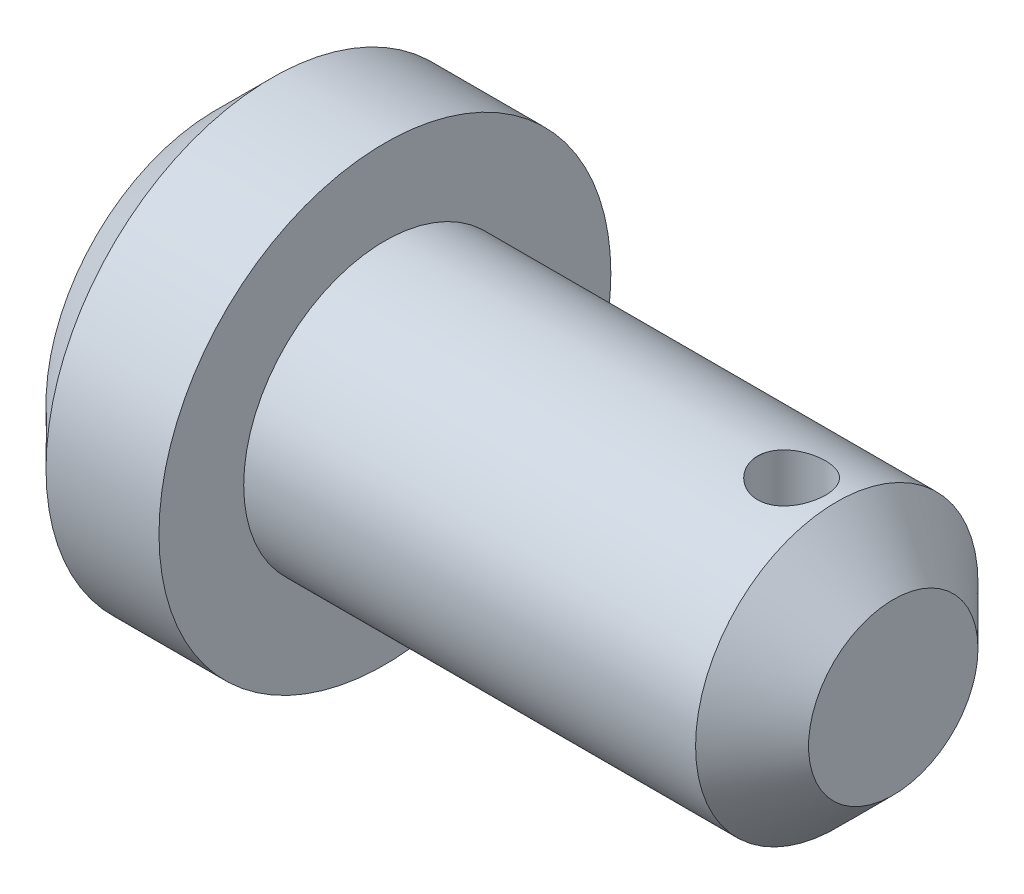
ISO-10303-21;
HEADER;
FILE_DESCRIPTION(('STEP AP214'),'2;1');
FILE_NAME('part.step','',(''),(''),'','','');
FILE_SCHEMA(('AUTOMOTIVE_DESIGN { 1 0 10303 214 1 1 1 1 }'));
ENDSEC;
DATA;
#1=APPLICATION_CONTEXT('core data for automotive mechanical design processes');
#2=APPLICATION_PROTOCOL_DEFINITION('international standard','automotive_design',2000,#1);
#3=PRODUCT_CONTEXT('',#1,'mechanical');
#4=PRODUCT('Part','Part','',(#3));
#5=PRODUCT_RELATED_PRODUCT_CATEGORY('part','',(#4));
#6=PRODUCT_DEFINITION_FORMATION('','',#4);
#7=PRODUCT_DEFINITION_CONTEXT('part definition',#1,'design');
#8=PRODUCT_DEFINITION('design','',#6,#7);
#9=PRODUCT_DEFINITION_SHAPE('','',#8);
#10=(LENGTH_UNIT() NAMED_UNIT(*) SI_UNIT(.MILLI.,.METRE.));
#11=(NAMED_UNIT(*) PLANE_ANGLE_UNIT() SI_UNIT($,.RADIAN.));
#12=(NAMED_UNIT(*) SI_UNIT($,.STERADIAN.) SOLID_ANGLE_UNIT());
#13=UNCERTAINTY_MEASURE_WITH_UNIT(LENGTH_MEASURE(1.E-05),#10,'distance_accuracy_value','');
#14=(GEOMETRIC_REPRESENTATION_CONTEXT(3) GLOBAL_UNCERTAINTY_ASSIGNED_CONTEXT((#13)) GLOBAL_UNIT_ASSIGNED_CONTEXT((#10,
#11,#12)) REPRESENTATION_CONTEXT('',''));
#15=CARTESIAN_POINT('',(0.,0.,0.));
#16=DIRECTION('',(0.,0.,1.));
#17=DIRECTION('',(1.,0.,0.));
#18=AXIS2_PLACEMENT_3D('',#15,#16,#17);
#19=CARTESIAN_POINT('',(60.,0.,0.));
#20=DIRECTION('',(-1.,0.,0.));
#21=DIRECTION('',(0.,0.,1.));
#22=AXIS2_PLACEMENT_3D('',#19,#20,#21);
#23=CYLINDRICAL_SURFACE('',#22,40.);
#24=CARTESIAN_POINT('',(-49.9999999999999,0.,0.));
#25=DIRECTION('',(1.,0.,0.));
#26=DIRECTION('',(0.,0.,-1.));
#27=AXIS2_PLACEMENT_3D('',#24,#25,#26);
#28=CIRCLE('',#27,40.);
#29=CARTESIAN_POINT('',(-49.9999999999999,0.,40.));
#30=VERTEX_POINT('',#29);
#31=EDGE_CURVE('E102',#30,#30,#28,.T.);
#32=CARTESIAN_POINT('',(-30.,0.,0.));
#33=DIRECTION('',(1.,0.,0.));
#34=DIRECTION('',(0.,0.,-1.));
#35=AXIS2_PLACEMENT_3D('',#32,#33,#34);
#36=CIRCLE('',#35,40.);
#37=CARTESIAN_POINT('',(-30.,0.,40.));
#38=VERTEX_POINT('',#37);
#39=EDGE_CURVE('E93',#38,#38,#36,.T.);
#40=CARTESIAN_POINT('',(-49.9999999999999,0.,40.));
#41=CARTESIAN_POINT('',(-49.7916666666665,0.,40.));
#42=CARTESIAN_POINT('',(-49.5833333333332,0.,40.));
#43=CARTESIAN_POINT('',(-49.1666666666665,0.,40.));
#44=CARTESIAN_POINT('',(-48.9583333333332,0.,40.));
#45=CARTESIAN_POINT('',(-48.5416666666666,0.,40.));
#46=CARTESIAN_POINT('',(-48.3333333333332,0.,40.));
#47=CARTESIAN_POINT('',(-47.9166666666666,0.,40.));
#48=CARTESIAN_POINT('',(-47.7083333333332,0.,40.));
#49=CARTESIAN_POINT('',(-47.2916666666666,0.,40.));
#50=CARTESIAN_POINT('',(-47.0833333333332,0.,40.));
#51=CARTESIAN_POINT('',(-46.6666666666666,0.,40.));
#52=CARTESIAN_POINT('',(-46.4583333333332,0.,40.));
#53=CARTESIAN_POINT('',(-46.0416666666666,0.,40.));
#54=CARTESIAN_POINT('',(-45.8333333333332,0.,40.));
#55=CARTESIAN_POINT('',(-45.4166666666666,0.,40.));
#56=CARTESIAN_POINT('',(-45.2083333333332,0.,40.));
#57=CARTESIAN_POINT('',(-44.7916666666666,0.,40.));
#58=CARTESIAN_POINT('',(-44.5833333333332,0.,40.));
#59=CARTESIAN_POINT('',(-44.1666666666666,0.,40.));
#60=CARTESIAN_POINT('',(-43.9583333333333,0.,40.));
#61=CARTESIAN_POINT('',(-43.5416666666666,0.,40.));
#62=CARTESIAN_POINT('',(-43.3333333333333,0.,40.));
#63=CARTESIAN_POINT('',(-42.9166666666666,0.,40.));
#64=CARTESIAN_POINT('',(-42.7083333333333,0.,40.));
#65=CARTESIAN_POINT('',(-42.2916666666666,0.,40.));
#66=CARTESIAN_POINT('',(-42.0833333333333,0.,40.));
#67=CARTESIAN_POINT('',(-41.6666666666666,0.,40.));
#68=CARTESIAN_POINT('',(-41.4583333333333,0.,40.));
#69=CARTESIAN_POINT('',(-41.0416666666666,0.,40.));
#70=CARTESIAN_POINT('',(-40.8333333333333,0.,40.));
#71=CARTESIAN_POINT('',(-40.4166666666666,0.,40.));
#72=CARTESIAN_POINT('',(-40.2083333333333,0.,40.));
#73=CARTESIAN_POINT('',(-39.7916666666666,0.,40.));
#74=CARTESIAN_POINT('',(-39.5833333333333,0.,40.));
#75=CARTESIAN_POINT('',(-39.1666666666666,0.,40.));
#76=CARTESIAN_POINT('',(-38.9583333333333,0.,40.));
#77=CARTESIAN_POINT('',(-38.5416666666666,0.,40.));
#78=CARTESIAN_POINT('',(-38.3333333333333,0.,40.));
#79=CARTESIAN_POINT('',(-37.9166666666666,0.,40.));
#80=CARTESIAN_POINT('',(-37.7083333333333,0.,40.));
#81=CARTESIAN_POINT('',(-37.2916666666666,0.,40.));
#82=CARTESIAN_POINT('',(-37.0833333333333,0.,40.));
#83=CARTESIAN_POINT('',(-36.6666666666666,0.,40.));
#84=CARTESIAN_POINT('',(-36.4583333333333,0.,40.));
#85=CARTESIAN_POINT('',(-36.0416666666666,0.,40.));
#86=CARTESIAN_POINT('',(-35.8333333333333,0.,40.));
#87=CARTESIAN_POINT('',(-35.4166666666667,0.,40.));
#88=CARTESIAN_POINT('',(-35.2083333333333,0.,40.));
#89=CARTESIAN_POINT('',(-34.7916666666667,0.,40.));
#90=CARTESIAN_POINT('',(-34.5833333333333,0.,40.));
#91=CARTESIAN_POINT('',(-34.1666666666667,0.,40.));
#92=CARTESIAN_POINT('',(-33.9583333333333,0.,40.));
#93=CARTESIAN_POINT('',(-33.5416666666667,0.,40.));
#94=CARTESIAN_POINT('',(-33.3333333333333,0.,40.));
#95=CARTESIAN_POINT('',(-32.9166666666667,0.,40.));
#96=CARTESIAN_POINT('',(-32.7083333333333,0.,40.));
#97=CARTESIAN_POINT('',(-32.2916666666667,0.,40.));
#98=CARTESIAN_POINT('',(-32.0833333333333,0.,40.));
#99=CARTESIAN_POINT('',(-31.6666666666667,0.,40.));
#100=CARTESIAN_POINT('',(-31.4583333333333,0.,40.));
#101=CARTESIAN_POINT('',(-31.0416666666667,0.,40.));
#102=CARTESIAN_POINT('',(-30.8333333333333,0.,40.));
#103=CARTESIAN_POINT('',(-30.4166666666667,0.,40.));
#104=CARTESIAN_POINT('',(-30.2083333333333,0.,40.));
#105=CARTESIAN_POINT('',(-30.,0.,40.));
#106=B_SPLINE_CURVE_WITH_KNOTS('',3,(#40,#41,#42,#43,#44,#45,#46,#47,#48,#49,#50,#51,#52,#53,
#54,#55,#56,#57,#58,#59,#60,#61,#62,#63,#64,#65,#66,#67,#68,#69,#70,#71,#72,#73,#74,#75,#76,#77,
#78,#79,#80,#81,#82,#83,#84,#85,#86,#87,#88,#89,#90,#91,#92,#93,#94,#95,#96,#97,#98,#99,#100,
#101,#102,#103,#104,#105),.UNSPECIFIED.,.F.,.F.,(4,2,2,2,2,2,2,2,2,2,2,2,2,2,2,2,2,2,2,2,2,2,2,
2,2,2,2,2,2,2,2,2,4),(0.,0.625000000000001,1.24999999999999,1.87499999999999,2.49999999999997,
3.12499999999998,3.74999999999998,4.37499999999996,4.99999999999996,5.62499999999996,
6.24999999999995,6.87499999999995,7.49999999999995,8.12499999999994,8.74999999999994,
9.37499999999993,9.99999999999993,10.6249999999999,11.2499999999999,11.8749999999999,
12.4999999999999,13.1249999999999,13.7499999999999,14.3749999999999,14.9999999999999,
15.6249999999999,16.2499999999999,16.8749999999999,17.4999999999999,18.1249999999999,
18.7499999999999,19.3749999999999,19.9999999999999),.UNSPECIFIED.);
#107=EDGE_CURVE('BSEAM41',#30,#38,#106,.T.);
#108=ORIENTED_EDGE('',*,*,#31,.T.);
#109=ORIENTED_EDGE('',*,*,#39,.F.);
#110=ORIENTED_EDGE('',*,*,#107,.T.);
#111=ORIENTED_EDGE('',*,*,#107,.F.);
#112=EDGE_LOOP('',(#108,#110,#109,#111));
#113=FACE_BOUND('',#112,.T.);
#114=ADVANCED_FACE('F41',(#113),#23,.T.);
#115=CARTESIAN_POINT('',(-60.,0.,0.));
#116=DIRECTION('',(1.,0.,0.));
#117=DIRECTION('',(0.,0.,-1.));
#118=AXIS2_PLACEMENT_3D('',#115,#116,#117);
#119=PLANE('',#118);
#120=CARTESIAN_POINT('',(-60.,0.,0.));
#121=DIRECTION('',(1.,0.,0.));
#122=DIRECTION('',(0.,0.,-1.));
#123=AXIS2_PLACEMENT_3D('',#120,#121,#122);
#124=CIRCLE('',#123,29.9999999999998);
#125=CARTESIAN_POINT('',(-60.,0.,-29.9999999999998));
#126=VERTEX_POINT('',#125);
#127=EDGE_CURVE('E105',#126,#126,#124,.F.);
#128=ORIENTED_EDGE('',*,*,#127,.T.);
#129=EDGE_LOOP('',(#128));
#130=FACE_BOUND('',#129,.T.);
#131=ADVANCED_FACE('F148',(#130),#119,.F.);
#132=CARTESIAN_POINT('',(-30.,0.,0.));
#133=DIRECTION('',(1.,0.,0.));
#134=DIRECTION('',(0.,0.,-1.));
#135=AXIS2_PLACEMENT_3D('',#132,#133,#134);
#136=CYLINDRICAL_SURFACE('',#135,25.);
#137=CARTESIAN_POINT('',(42.,-24.2693221990232,5.99999999999999));
#138=CARTESIAN_POINT('',(41.8340597324206,-24.2693192173439,6.00000460058747));
#139=CARTESIAN_POINT('',(41.6681709278624,-24.2710270328907,5.99311472313626));
#140=CARTESIAN_POINT('',(41.3375547977683,-24.2777997433195,5.96562344868168));
#141=CARTESIAN_POINT('',(41.1728276219589,-24.2828650632483,5.94502031563236));
#142=CARTESIAN_POINT('',(40.8457209948053,-24.2962060432289,5.89025958920487));
#143=CARTESIAN_POINT('',(40.683342422632,-24.304482874777,5.85609704951729));
#144=CARTESIAN_POINT('',(40.3620776767058,-24.324002012079,5.77448580831012));
#145=CARTESIAN_POINT('',(40.203192816905,-24.3352454135442,5.72703219729493));
#146=CARTESIAN_POINT('',(39.8903344673029,-24.3603450339749,5.61930954739397));
#147=CARTESIAN_POINT('',(39.7363534382128,-24.3741969907612,5.55906139358702));
#148=CARTESIAN_POINT('',(39.4340110530831,-24.4041320001377,5.42613868912026));
#149=CARTESIAN_POINT('',(39.2856517976634,-24.420215876438,5.35345954837852));
#150=CARTESIAN_POINT('',(38.9956383615798,-24.4541500249133,5.19624934621713));
#151=CARTESIAN_POINT('',(38.8539816961744,-24.471999634801,5.11172272360156));
#152=CARTESIAN_POINT('',(38.5781694487184,-24.5089827826595,4.93135257338599));
#153=CARTESIAN_POINT('',(38.4440167113146,-24.5281168015673,4.83550479634856));
#154=CARTESIAN_POINT('',(38.1817872297769,-24.5674915774464,4.63134479435268));
#155=CARTESIAN_POINT('',(38.0538624286457,-24.5877460219987,4.52284000132128));
#156=CARTESIAN_POINT('',(37.8075154504067,-24.628482704143,4.29548353417836));
#157=CARTESIAN_POINT('',(37.6890968171529,-24.6489650234755,4.17662803548192));
#158=CARTESIAN_POINT('',(37.4626293146081,-24.6895792444555,3.92942214664512));
#159=CARTESIAN_POINT('',(37.3545775870675,-24.7097112414296,3.80107439098763));
#160=CARTESIAN_POINT('',(37.1495012350933,-24.749084932891,3.53564701496836));
#161=CARTESIAN_POINT('',(37.0524806874831,-24.7683262966769,3.39856419538245));
#162=CARTESIAN_POINT('',(36.8690555516101,-24.805612728147,3.11485061597084));
#163=CARTESIAN_POINT('',(36.7827982775735,-24.8236399057151,2.96812218206262));
#164=CARTESIAN_POINT('',(36.6229465907055,-24.8577272433076,2.66763492888512));
#165=CARTESIAN_POINT('',(36.5493569572847,-24.8737866602544,2.5138734836835));
#166=CARTESIAN_POINT('',(36.4154867338232,-24.9034639147108,2.20050084057473));
#167=CARTESIAN_POINT('',(36.3551998030764,-24.917082914856,2.04089247207774));
#168=CARTESIAN_POINT('',(36.2483649391806,-24.9415044760467,1.71693448898555));
#169=CARTESIAN_POINT('',(36.2018219511619,-24.9523060231976,1.55258319115472));
#170=CARTESIAN_POINT('',(36.0849911599461,-24.9796180760798,1.0604267514532));
#171=CARTESIAN_POINT('',(36.0348243465292,-24.9916494382249,0.727223064781637));
#172=CARTESIAN_POINT('',(36.0018598223319,-24.9995546719704,0.225051972672737));
#173=CARTESIAN_POINT('',(35.9979260461296,-25.0004978214515,0.0572008556931635));
#174=CARTESIAN_POINT('',(36.0041100366234,-24.9990135577545,-0.278247999700322));
#175=CARTESIAN_POINT('',(36.014227977215,-24.9965861028638,-0.445845734952837));
#176=CARTESIAN_POINT('',(36.0649257254733,-24.9844710986104,-0.939451198306501));
#177=CARTESIAN_POINT('',(36.1253937190891,-24.9700581884779,-1.26352376365918));
#178=CARTESIAN_POINT('',(36.2981839251966,-24.9299774285752,-1.8966100087818));
#179=CARTESIAN_POINT('',(36.4105087710679,-24.9043090072343,-2.20562292291579));
#180=CARTESIAN_POINT('',(36.6847735436076,-24.8441871252282,-2.80308340285012));
#181=CARTESIAN_POINT('',(36.8471264788453,-24.8096609520016,-3.09133416391586));
#182=CARTESIAN_POINT('',(37.2165269000294,-24.7355808399422,-3.63689114777194));
#183=CARTESIAN_POINT('',(37.423581610417,-24.6960260888452,-3.89419235819687));
#184=CARTESIAN_POINT('',(37.8826307930772,-24.6150468786432,-4.37733250714645));
#185=CARTESIAN_POINT('',(38.1356187298665,-24.5736003966327,-4.60222487048293));
#186=CARTESIAN_POINT('',(38.6761512747884,-24.4944202534268,-5.00659136952866));
#187=CARTESIAN_POINT('',(38.9636972486,-24.4566867390692,-5.18606370943938));
#188=CARTESIAN_POINT('',(39.5669305117367,-24.3891322466935,-5.49503965337249));
#189=CARTESIAN_POINT('',(39.8827301014658,-24.3593449045093,-5.62433186444416));
#190=CARTESIAN_POINT('',(40.5324662474271,-24.3114966451333,-5.82770650444348));
#191=CARTESIAN_POINT('',(40.8663992508976,-24.2934334398264,-5.90179970658056));
#192=CARTESIAN_POINT('',(41.5341867586329,-24.2715545321338,-5.99113700492851));
#193=CARTESIAN_POINT('',(41.8678441395521,-24.2674017566251,-6.00777368474902));
#194=CARTESIAN_POINT('',(42.5331663936186,-24.2728991225919,-5.98552405004054));
#195=CARTESIAN_POINT('',(42.8648314319801,-24.2825481032417,-5.94664240499739));
#196=CARTESIAN_POINT('',(43.5116918144507,-24.3142403018894,-5.81567711192226));
#197=CARTESIAN_POINT('',(43.8270582774518,-24.3360979424442,-5.72438949541308));
#198=CARTESIAN_POINT('',(44.4380157157244,-24.3895714349639,-5.49207803402931));
#199=CARTESIAN_POINT('',(44.7336044883746,-24.421188371618,-5.35104866039817));
#200=CARTESIAN_POINT('',(45.3025572218462,-24.491337816706,-5.02029588326829));
#201=CARTESIAN_POINT('',(45.5754176845888,-24.529985907154,-4.82973151657671));
#202=CARTESIAN_POINT('',(46.0858025313716,-24.609553113729,-4.40637723136315));
#203=CARTESIAN_POINT('',(46.3233215739802,-24.6504725718652,-4.17358094176828));
#204=CARTESIAN_POINT('',(46.7618259564236,-24.7311017019711,-3.66607172916321));
#205=CARTESIAN_POINT('',(46.9618521878375,-24.770762345906,-3.39052236174369));
#206=CARTESIAN_POINT('',(47.3128322495327,-24.8434406642277,-2.80874047615625));
#207=CARTESIAN_POINT('',(47.4637885743999,-24.8764586762761,-2.50250951879602));
#208=CARTESIAN_POINT('',(47.6493644523968,-24.9181020803638,-2.02815096730082));
#209=CARTESIAN_POINT('',(47.7043082440511,-24.9306431435962,-1.86803584664665));
#210=CARTESIAN_POINT('',(47.8005153664138,-24.9528307363167,-1.5435669629554));
#211=CARTESIAN_POINT('',(47.8417838259838,-24.9624783508485,-1.37921481397561));
#212=CARTESIAN_POINT('',(47.910290311299,-24.9785993962541,-1.04746058126016));
#213=CARTESIAN_POINT('',(47.9375276280121,-24.9850726667188,-0.880058343837643));
#214=CARTESIAN_POINT('',(47.9777401855718,-24.994659296045,-0.543455945222833));
#215=CARTESIAN_POINT('',(47.9907160387597,-24.997772799164,-0.374255861539255));
#216=CARTESIAN_POINT('',(48.0021470108494,-25.0005148115007,-0.0395721662636017));
#217=CARTESIAN_POINT('',(48.0009565702226,-25.0002283873103,0.125898766906477));
#218=CARTESIAN_POINT('',(47.9849199007086,-24.9963838456846,0.456136647513656));
#219=CARTESIAN_POINT('',(47.9700739681453,-24.9928257992435,0.620903610148953));
#220=CARTESIAN_POINT('',(47.9268472599295,-24.9825354772041,0.948575696498025));
#221=CARTESIAN_POINT('',(47.8984644479739,-24.9758027240481,1.11148053632312));
#222=CARTESIAN_POINT('',(47.8284088101355,-24.9593507893913,1.43419100404799));
#223=CARTESIAN_POINT('',(47.7867406960191,-24.9496326667265,1.59399770944886));
#224=CARTESIAN_POINT('',(47.690650753289,-24.9275215666658,1.90878490028134));
#225=CARTESIAN_POINT('',(47.6362843170044,-24.9151402247435,2.06378312590838));
#226=CARTESIAN_POINT('',(47.5151388528865,-24.8880146824749,2.3685707959777));
#227=CARTESIAN_POINT('',(47.4483641629035,-24.8732713081285,2.51836203909182));
#228=CARTESIAN_POINT('',(47.3028475672212,-24.841802398867,2.81187682420641));
#229=CARTESIAN_POINT('',(47.2241004624363,-24.8250760035128,2.95559769529925));
#230=CARTESIAN_POINT('',(47.0552433097921,-24.7900921246488,3.23593617076045));
#231=CARTESIAN_POINT('',(46.9651370434316,-24.7718351513474,3.37255611776948));
#232=CARTESIAN_POINT('',(46.771977422558,-24.7338351675459,3.64090348698622));
#233=CARTESIAN_POINT('',(46.6686764866578,-24.7140678232284,3.77244930795076));
#234=CARTESIAN_POINT('',(46.4515447693523,-24.6739715765701,4.02636882328123));
#235=CARTESIAN_POINT('',(46.3377176061222,-24.6536428688592,4.1487456433139));
#236=CARTESIAN_POINT('',(46.1001846094013,-24.6129603609016,4.38365180469934));
#237=CARTESIAN_POINT('',(45.9764728684062,-24.5926065529162,4.49617517167718));
#238=CARTESIAN_POINT('',(45.7200853616725,-24.5524543239015,4.71050671781095));
#239=CARTESIAN_POINT('',(45.5874128702772,-24.532655703704,4.81231877656933));
#240=CARTESIAN_POINT('',(45.3115626264918,-24.4938254842292,5.00624248933443));
#241=CARTESIAN_POINT('',(45.1682431364982,-24.474813007441,5.09815651544128));
#242=CARTESIAN_POINT('',(44.8742056916912,-24.4384897622653,5.26952462166942));
#243=CARTESIAN_POINT('',(44.7234904855787,-24.4211783687267,5.34898328559684));
#244=CARTESIAN_POINT('',(44.4157172840035,-24.3887740639133,5.49484184745971));
#245=CARTESIAN_POINT('',(44.2586623649209,-24.3736800927344,5.56124798952491));
#246=CARTESIAN_POINT('',(43.9393155178688,-24.3461620490209,5.68050372849539));
#247=CARTESIAN_POINT('',(43.7770244408601,-24.3337375451432,5.73335551583449));
#248=CARTESIAN_POINT('',(43.3509444027554,-24.3054947105591,5.85223691155715));
#249=CARTESIAN_POINT('',(43.0839264079743,-24.2920191452793,5.90755575023751));
#250=CARTESIAN_POINT('',(42.5445591923274,-24.2739356520306,5.98143220718611));
#251=CARTESIAN_POINT('',(42.2722103539425,-24.2693270902047,5.99999245314252));
#252=CARTESIAN_POINT('',(42.,-24.2693221990232,5.99999999999999));
#253=B_SPLINE_CURVE_WITH_KNOTS('',3,(#137,#138,#139,#140,#141,#142,#143,#144,#145,#146,#147,
#148,#149,#150,#151,#152,#153,#154,#155,#156,#157,#158,#159,#160,#161,#162,#163,#164,#165,#166,
#167,#168,#169,#170,#171,#172,#173,#174,#175,#176,#177,#178,#179,#180,#181,#182,#183,#184,#185,
#186,#187,#188,#189,#190,#191,#192,#193,#194,#195,#196,#197,#198,#199,#200,#201,#202,#203,#204,
#205,#206,#207,#208,#209,#210,#211,#212,#213,#214,#215,#216,#217,#218,#219,#220,#221,#222,#223,
#224,#225,#226,#227,#228,#229,#230,#231,#232,#233,#234,#235,#236,#237,#238,#239,#240,#241,#242,
#243,#244,#245,#246,#247,#248,#249,#250,#251,#252),.UNSPECIFIED.,.T.,.F.,(4,2,2,2,2,2,2,2,2,2,2,
2,2,2,2,2,2,2,2,2,2,2,2,2,2,2,2,2,2,2,2,2,2,2,2,2,2,2,2,2,2,2,2,2,2,2,2,2,2,2,2,2,2,2,2,2,2,4),
(0.,0.497580591380397,0.995224186553663,1.49304948324961,1.99105891120688,2.48826158123244,
2.98564823885731,3.4828490401512,3.98023706425765,4.48653742340696,4.99302566076185,
5.49937385101409,6.00590856964271,6.51875380835025,7.03179211782622,7.54458535785559,
8.05756287894228,9.06317072582737,9.56637068685639,10.0695768752428,11.0544731736285,
12.039419492233,13.0327253814723,14.0261919233718,15.0444773123882,16.0628029556731,
17.0853730875996,18.1077435918425,19.1051538629731,20.10248024975,21.0850439079103,
22.0677168116698,23.0683069952269,24.0690482527066,25.0926627677995,26.1162252368615,
26.624940138715,27.133464033202,27.6420136222754,28.150541375013,28.6463730888495,
29.1421940434047,29.63808960602,30.1338094895388,30.6274060608766,31.1208303973833,
31.6144696213305,32.1079449431356,32.6126284711583,33.1171391648261,33.6219536669564,
34.1265846927702,34.639920621622,35.1530671874621,35.6659676710411,36.1787852157024,
36.9950805869966,37.8113176033061),.UNSPECIFIED.);
#254=CARTESIAN_POINT('',(42.,-24.2693221990232,5.99999999999999));
#255=VERTEX_POINT('',#254);
#256=EDGE_CURVE('E46',#255,#255,#253,.T.);
#257=ORIENTED_EDGE('',*,*,#256,.F.);
#258=EDGE_LOOP('',(#257));
#259=FACE_BOUND('',#258,.T.);
#260=CARTESIAN_POINT('',(36.1050339271545,24.975,1.11775444530582));
#261=CARTESIAN_POINT('',(36.1363511597315,24.9676181726477,1.28302371813901));
#262=CARTESIAN_POINT('',(36.174640146605,24.9586263629284,1.44688746972125));
#263=CARTESIAN_POINT('',(36.2647545871618,24.9377421840634,1.77062801646587));
#264=CARTESIAN_POINT('',(36.3165774313342,24.9258503741062,1.93050557371752));
#265=CARTESIAN_POINT('',(36.4332735295625,24.8995031446735,2.24491615468309));
#266=CARTESIAN_POINT('',(36.4981262318353,24.8850517665628,2.39945715136995));
#267=CARTESIAN_POINT('',(36.6404267010962,24.8539775001206,2.70240207925515));
#268=CARTESIAN_POINT('',(36.7178747947995,24.8373545554626,2.85080585113309));
#269=CARTESIAN_POINT('',(36.8847585743185,24.8024000052865,3.14041832644352));
#270=CARTESIAN_POINT('',(36.974189439129,24.7840690878327,3.28162989213167));
#271=CARTESIAN_POINT('',(37.1644623822497,24.7461861901422,3.55604603642248));
#272=CARTESIAN_POINT('',(37.2653086693867,24.7266337607367,3.68924763387959));
#273=CARTESIAN_POINT('',(37.4776762176155,24.6868495085147,3.94669835850302));
#274=CARTESIAN_POINT('',(37.5891955039233,24.6666178118283,4.07094913437725));
#275=CARTESIAN_POINT('',(37.8222270449298,24.6260151330239,4.30976308892642));
#276=CARTESIAN_POINT('',(37.9437430129784,24.6056441017485,4.42432263537182));
#277=CARTESIAN_POINT('',(38.1978743429328,24.5650196549601,4.64462596589233));
#278=CARTESIAN_POINT('',(38.3306312606349,24.5447728257871,4.75020774964943));
#279=CARTESIAN_POINT('',(38.6047574074324,24.5052907141674,4.94985754563087));
#280=CARTESIAN_POINT('',(38.7461298414048,24.4860558131657,5.04392123361057));
#281=CARTESIAN_POINT('',(39.0364427885705,24.4491707940374,5.21978165097011));
#282=CARTESIAN_POINT('',(39.1853807567768,24.431520148436,5.30158246937402));
#283=CARTESIAN_POINT('',(39.4899047419303,24.3983127872166,5.45236636269776));
#284=CARTESIAN_POINT('',(39.6454931450384,24.3827568316194,5.52134478867712));
#285=CARTESIAN_POINT('',(39.9612376156718,24.3543010780931,5.64553420274183));
#286=CARTESIAN_POINT('',(40.1213612231202,24.3413861137389,5.70082420930313));
#287=CARTESIAN_POINT('',(40.4459050763594,24.3184912049266,5.79771219066273));
#288=CARTESIAN_POINT('',(40.6103252856186,24.3085112355227,5.8393102818351));
#289=CARTESIAN_POINT('',(40.942222150944,24.2917976528785,5.90845443963803));
#290=CARTESIAN_POINT('',(41.1096981567154,24.2850633571092,5.93600346070258));
#291=CARTESIAN_POINT('',(41.4464866258639,24.275049929255,5.97682146111775));
#292=CARTESIAN_POINT('',(41.6157990900404,24.2717707986742,5.99009043425176));
#293=CARTESIAN_POINT('',(41.9504545989968,24.268811353851,6.00206885543121));
#294=CARTESIAN_POINT('',(42.1157834081253,24.2690376153185,6.00115626280563));
#295=CARTESIAN_POINT('',(42.4458168305454,24.272855578407,5.9856950824912));
#296=CARTESIAN_POINT('',(42.6105212277363,24.27644835431,5.97114214205682));
#297=CARTESIAN_POINT('',(42.9380355696479,24.2868920183904,5.92852053576164));
#298=CARTESIAN_POINT('',(43.1008458468713,24.293742325607,5.90045427990722));
#299=CARTESIAN_POINT('',(43.423450131139,24.31049689479,5.83103879708094));
#300=CARTESIAN_POINT('',(43.5832440947143,24.320401200733,5.78968937883552));
#301=CARTESIAN_POINT('',(43.8978967825962,24.3429149748122,5.69428462382619));
#302=CARTESIAN_POINT('',(44.0527765769181,24.3555103409693,5.64029538748453));
#303=CARTESIAN_POINT('',(44.3573659805566,24.3830714744694,5.51993053429697));
#304=CARTESIAN_POINT('',(44.5070772653959,24.3980364646718,5.45355897708293));
#305=CARTESIAN_POINT('',(44.8004654947186,24.4299269405629,5.30887522034552));
#306=CARTESIAN_POINT('',(44.944140126773,24.4468531683692,5.23055849729182));
#307=CARTESIAN_POINT('',(45.2244350445308,24.4821905546219,5.06257903983189));
#308=CARTESIAN_POINT('',(45.3610576455438,24.5006012205485,4.97292006308675));
#309=CARTESIAN_POINT('',(45.6296788490794,24.5388766152155,4.78052132896246));
#310=CARTESIAN_POINT('',(45.7614841257745,24.5587658206714,4.67751642813021));
#311=CARTESIAN_POINT('',(46.0159515929751,24.5990260984321,4.46094589566158));
#312=CARTESIAN_POINT('',(46.138616896506,24.6193970035296,4.3473838896119));
#313=CARTESIAN_POINT('',(46.3741563793058,24.6600846175486,4.11031622179338));
#314=CARTESIAN_POINT('',(46.4870220568036,24.680401264878,3.98680210155378));
#315=CARTESIAN_POINT('',(46.7020530778569,24.7203993544678,3.73076864144497));
#316=CARTESIAN_POINT('',(46.8042223188317,24.7400810262706,3.59825261079006));
#317=CARTESIAN_POINT('',(46.9988898636843,24.7786124705731,3.32265773240739));
#318=CARTESIAN_POINT('',(47.0911889304585,24.7974418057572,3.17943519870088));
#319=CARTESIAN_POINT('',(47.2633244467285,24.8333545537699,2.88555059910161));
#320=CARTESIAN_POINT('',(47.3431657215081,24.8504386416965,2.73489144355321));
#321=CARTESIAN_POINT('',(47.4897079681621,24.8823589105403,2.42736074659795));
#322=CARTESIAN_POINT('',(47.5564280127764,24.8971983468773,2.27049862636146));
#323=CARTESIAN_POINT('',(47.6763121694426,24.9242272851458,1.9515326409192));
#324=CARTESIAN_POINT('',(47.7294840957993,24.9364183140292,1.78943185835654));
#325=CARTESIAN_POINT('',(47.7992233242682,24.9525644310901,1.54161474077413));
#326=CARTESIAN_POINT('',(47.8209598678148,24.9576279576738,1.45739279108557));
#327=CARTESIAN_POINT('',(47.8607330213121,24.9669346216911,1.28815838542834));
#328=CARTESIAN_POINT('',(47.8787747124767,24.9711788853189,1.20314718544603));
#329=CARTESIAN_POINT('',(47.8949660728454,24.975,1.11775444530582));
#330=B_SPLINE_CURVE_WITH_KNOTS('',3,(#260,#261,#262,#263,#264,#265,#266,#267,#268,#269,#270,
#271,#272,#273,#274,#275,#276,#277,#278,#279,#280,#281,#282,#283,#284,#285,#286,#287,#288,#289,
#290,#291,#292,#293,#294,#295,#296,#297,#298,#299,#300,#301,#302,#303,#304,#305,#306,#307,#308,
#309,#310,#311,#312,#313,#314,#315,#316,#317,#318,#319,#320,#321,#322,#323,#324,#325,#326,#327,
#328,#329),.UNSPECIFIED.,.F.,.F.,(4,2,2,2,2,2,2,2,2,2,2,2,2,2,2,2,2,2,2,2,2,2,2,2,2,2,2,2,2,2,2,
2,2,2,4),(0.,0.504942957711112,1.00978862738079,1.51384417667573,2.01791280288788,
2.52177923370483,3.02583204717551,3.5297917773384,4.03393956017062,4.54581315444478,
5.057878336289,5.56977238962304,6.08185167696299,6.59090211635798,7.09994822898091,
7.60888724811376,8.11782648880615,8.61322557408712,9.10878279907178,9.60425167756968,
10.0997276909912,10.5926682948972,11.0854475678397,11.5784139174663,12.0712173741626,
12.5760085680115,13.0806270392817,13.5856790122801,14.09054631625,14.6041994579033,
15.1176531494445,15.6303548877845,16.1427602363635,16.4040722606683,16.6650224754007),.UNSPECIFIED.);
#331=CARTESIAN_POINT('',(36.1050339271545,24.975,1.11775444530582));
#332=VERTEX_POINT('',#331);
#333=CARTESIAN_POINT('',(47.8949660728454,24.975,1.11775444530582));
#334=VERTEX_POINT('',#333);
#335=EDGE_CURVE('E11',#332,#334,#330,.T.);
#336=ORIENTED_EDGE('',*,*,#335,.F.);
#337=CARTESIAN_POINT('',(36.1192369049588,24.9723,-1.17653419414864));
#338=CARTESIAN_POINT('',(36.0827485065979,24.97923769451,-1.02963294649269));
#339=CARTESIAN_POINT('',(36.053058680177,24.9849267265298,-0.880969537197548));
#340=CARTESIAN_POINT('',(36.0075509070328,24.9936842991306,-0.581370949647718));
#341=CARTESIAN_POINT('',(35.9917410743193,24.996751306893,-0.430434494974235));
#342=CARTESIAN_POINT('',(35.9745084867404,25.0000950097253,-0.131141243152006));
#343=CARTESIAN_POINT('',(35.9727683521668,25.0004332588548,0.0171966666789313));
#344=CARTESIAN_POINT('',(35.9828573413141,24.9984744773783,0.313295739263719));
#345=CARTESIAN_POINT('',(35.9946762418278,24.9961794322168,0.461057252369551));
#346=CARTESIAN_POINT('',(36.0251945145465,24.9902878152985,0.703300544266995));
#347=CARTESIAN_POINT('',(36.0400307328151,24.9874292975187,0.798305678565253));
#348=CARTESIAN_POINT('',(36.075375302303,24.9806531883932,0.987956761463441));
#349=CARTESIAN_POINT('',(36.0959254198695,24.97672780362,1.08259465251196));
#350=CARTESIAN_POINT('',(36.1192369049588,24.9723,1.17653419414862));
#351=B_SPLINE_CURVE_WITH_KNOTS('',3,(#337,#338,#339,#340,#341,#342,#343,#344,#345,#346,#347,
#348,#349,#350),.UNSPECIFIED.,.F.,.F.,(4,2,2,2,2,2,4),(0.,0.454430379585496,0.90912623493984,
1.35353576136354,1.79761043310476,2.086048829116,2.37665368293065),.UNSPECIFIED.);
#352=CARTESIAN_POINT('',(36.1050339271545,24.975,-1.11775444530582));
#353=VERTEX_POINT('',#352);
#354=EDGE_CURVE('E62',#353,#332,#351,.T.);
#355=ORIENTED_EDGE('',*,*,#354,.F.);
#356=CARTESIAN_POINT('',(47.8949660728454,24.975,-1.11775444530582));
#357=CARTESIAN_POINT('',(47.8636488402685,24.9676181726477,-1.28302371813901));
#358=CARTESIAN_POINT('',(47.8253598533949,24.9586263629284,-1.44688746972125));
#359=CARTESIAN_POINT('',(47.7352454128382,24.9377421840634,-1.77062801646586));
#360=CARTESIAN_POINT('',(47.6834225686658,24.9258503741062,-1.93050557371752));
#361=CARTESIAN_POINT('',(47.5667264704375,24.8995031446736,-2.24491615468308));
#362=CARTESIAN_POINT('',(47.5018737681647,24.8850517665628,-2.39945715136995));
#363=CARTESIAN_POINT('',(47.3595732989038,24.8539775001206,-2.70240207925514));
#364=CARTESIAN_POINT('',(47.2821252052005,24.8373545554626,-2.85080585113308));
#365=CARTESIAN_POINT('',(47.1152414256815,24.8024000052865,-3.14041832644352));
#366=CARTESIAN_POINT('',(47.025810560871,24.7840690878327,-3.28162989213167));
#367=CARTESIAN_POINT('',(46.8355376177503,24.7461861901422,-3.55604603642248));
#368=CARTESIAN_POINT('',(46.7346913306133,24.7266337607367,-3.68924763387959));
#369=CARTESIAN_POINT('',(46.5223237823845,24.6868495085147,-3.94669835850303));
#370=CARTESIAN_POINT('',(46.4108044960767,24.6666178118283,-4.07094913437725));
#371=CARTESIAN_POINT('',(46.1777729550702,24.6260151330239,-4.30976308892642));
#372=CARTESIAN_POINT('',(46.0562569870216,24.6056441017485,-4.42432263537182));
#373=CARTESIAN_POINT('',(45.8021256570672,24.5650196549601,-4.64462596589233));
#374=CARTESIAN_POINT('',(45.669368739365,24.5447728257871,-4.75020774964942));
#375=CARTESIAN_POINT('',(45.3952425925676,24.5052907141674,-4.94985754563086));
#376=CARTESIAN_POINT('',(45.2538701585952,24.4860558131657,-5.04392123361057));
#377=CARTESIAN_POINT('',(44.9635572114295,24.4491707940374,-5.21978165097011));
#378=CARTESIAN_POINT('',(44.8146192432232,24.431520148436,-5.30158246937402));
#379=CARTESIAN_POINT('',(44.5100952580697,24.3983127872166,-5.45236636269775));
#380=CARTESIAN_POINT('',(44.3545068549616,24.3827568316194,-5.52134478867711));
#381=CARTESIAN_POINT('',(44.0387623843282,24.3543010780931,-5.64553420274182));
#382=CARTESIAN_POINT('',(43.8786387768798,24.3413861137389,-5.70082420930313));
#383=CARTESIAN_POINT('',(43.5540949236406,24.3184912049266,-5.79771219066273));
#384=CARTESIAN_POINT('',(43.3896747143814,24.3085112355227,-5.83931028183509));
#385=CARTESIAN_POINT('',(43.057777849056,24.2917976528785,-5.90845443963803));
#386=CARTESIAN_POINT('',(42.8903018432846,24.2850633571092,-5.93600346070257));
#387=CARTESIAN_POINT('',(42.5535133741361,24.275049929255,-5.97682146111775));
#388=CARTESIAN_POINT('',(42.3842009099596,24.2717707986742,-5.99009043425175));
#389=CARTESIAN_POINT('',(42.0495454010032,24.268811353851,-6.0020688554312));
#390=CARTESIAN_POINT('',(41.8842165918747,24.2690376153185,-6.00115626280563));
#391=CARTESIAN_POINT('',(41.5541831694546,24.272855578407,-5.9856950824912));
#392=CARTESIAN_POINT('',(41.3894787722637,24.27644835431,-5.97114214205682));
#393=CARTESIAN_POINT('',(41.0619644303521,24.2868920183904,-5.92852053576164));
#394=CARTESIAN_POINT('',(40.8991541531287,24.293742325607,-5.90045427990721));
#395=CARTESIAN_POINT('',(40.576549868861,24.31049689479,-5.83103879708093));
#396=CARTESIAN_POINT('',(40.4167559052857,24.320401200733,-5.78968937883552));
#397=CARTESIAN_POINT('',(40.1021032174038,24.3429149748122,-5.69428462382619));
#398=CARTESIAN_POINT('',(39.9472234230819,24.3555103409693,-5.64029538748453));
#399=CARTESIAN_POINT('',(39.6426340194433,24.3830714744694,-5.51993053429697));
#400=CARTESIAN_POINT('',(39.492922734604,24.3980364646718,-5.45355897708292));
#401=CARTESIAN_POINT('',(39.1995345052814,24.4299269405629,-5.30887522034552));
#402=CARTESIAN_POINT('',(39.055859873227,24.4468531683692,-5.23055849729181));
#403=CARTESIAN_POINT('',(38.7755649554692,24.4821905546219,-5.06257903983189));
#404=CARTESIAN_POINT('',(38.6389423544562,24.5006012205485,-4.97292006308675));
#405=CARTESIAN_POINT('',(38.3703211509206,24.5388766152155,-4.78052132896246));
#406=CARTESIAN_POINT('',(38.2385158742255,24.5587658206714,-4.6775164281302));
#407=CARTESIAN_POINT('',(37.9840484070249,24.5990260984321,-4.46094589566158));
#408=CARTESIAN_POINT('',(37.861383103494,24.6193970035296,-4.3473838896119));
#409=CARTESIAN_POINT('',(37.6258436206942,24.6600846175486,-4.11031622179338));
#410=CARTESIAN_POINT('',(37.5129779431964,24.680401264878,-3.98680210155378));
#411=CARTESIAN_POINT('',(37.2979469221431,24.7203993544678,-3.73076864144497));
#412=CARTESIAN_POINT('',(37.1957776811683,24.7400810262706,-3.59825261079006));
#413=CARTESIAN_POINT('',(37.0011101363157,24.7786124705731,-3.32265773240738));
#414=CARTESIAN_POINT('',(36.9088110695414,24.7974418057572,-3.17943519870088));
#415=CARTESIAN_POINT('',(36.7366755532715,24.8333545537699,-2.8855505991016));
#416=CARTESIAN_POINT('',(36.6568342784919,24.8504386416965,-2.7348914435532));
#417=CARTESIAN_POINT('',(36.5102920318379,24.8823589105403,-2.42736074659795));
#418=CARTESIAN_POINT('',(36.4435719872236,24.8971983468773,-2.27049862636146));
#419=CARTESIAN_POINT('',(36.3236878305574,24.9242272851458,-1.9515326409192));
#420=CARTESIAN_POINT('',(36.2705159042007,24.9364183140292,-1.78943185835654));
#421=CARTESIAN_POINT('',(36.2007766757318,24.9525644310901,-1.54161474077413));
#422=CARTESIAN_POINT('',(36.1790401321852,24.9576279576738,-1.45739279108557));
#423=CARTESIAN_POINT('',(36.1392669786879,24.9669346216911,-1.28815838542833));
#424=CARTESIAN_POINT('',(36.1212252875233,24.9711788853189,-1.20314718544602));
#425=CARTESIAN_POINT('',(36.1050339271545,24.975,-1.11775444530582));
#426=B_SPLINE_CURVE_WITH_KNOTS('',3,(#356,#357,#358,#359,#360,#361,#362,#363,#364,#365,#366,
#367,#368,#369,#370,#371,#372,#373,#374,#375,#376,#377,#378,#379,#380,#381,#382,#383,#384,#385,
#386,#387,#388,#389,#390,#391,#392,#393,#394,#395,#396,#397,#398,#399,#400,#401,#402,#403,#404,
#405,#406,#407,#408,#409,#410,#411,#412,#413,#414,#415,#416,#417,#418,#419,#420,#421,#422,#423,
#424,#425),.UNSPECIFIED.,.F.,.F.,(4,2,2,2,2,2,2,2,2,2,2,2,2,2,2,2,2,2,2,2,2,2,2,2,2,2,2,2,2,2,2,
2,2,2,4),(0.,0.504942957711114,1.00978862738079,1.51384417667573,2.01791280288788,
2.52177923370483,3.02583204717552,3.52979177733841,4.03393956017062,4.54581315444478,
5.057878336289,5.56977238962304,6.08185167696299,6.59090211635798,7.09994822898091,
7.60888724811375,8.11782648880615,8.61322557408712,9.10878279907178,9.60425167756967,
10.0997276909912,10.5926682948972,11.0854475678397,11.5784139174663,12.0712173741626,
12.5760085680115,13.0806270392817,13.5856790122801,14.0905463162499,14.6041994579033,
15.1176531494445,15.6303548877845,16.1427602363635,16.4040722606683,16.6650224754007),.UNSPECIFIED.);
#427=CARTESIAN_POINT('',(47.8949660728454,24.975,-1.11775444530582));
#428=VERTEX_POINT('',#427);
#429=EDGE_CURVE('E76',#428,#353,#426,.T.);
#430=ORIENTED_EDGE('',*,*,#429,.F.);
#431=CARTESIAN_POINT('',(47.8807630950412,24.9723,1.17653419414864));
#432=CARTESIAN_POINT('',(47.9172514934021,24.97923769451,1.02963294649268));
#433=CARTESIAN_POINT('',(47.946941319823,24.9849267265298,0.880969537197542));
#434=CARTESIAN_POINT('',(47.9924490929672,24.9936842991306,0.581370949647713));
#435=CARTESIAN_POINT('',(48.0082589256807,24.996751306893,0.43043449497423));
#436=CARTESIAN_POINT('',(48.0254915132596,25.0000950097253,0.131141243152001));
#437=CARTESIAN_POINT('',(48.0272316478332,25.0004332588548,-0.0171966666789359));
#438=CARTESIAN_POINT('',(48.0171426586859,24.9984744773783,-0.313295739263722));
#439=CARTESIAN_POINT('',(48.0053237581722,24.9961794322168,-0.461057252369554));
#440=CARTESIAN_POINT('',(47.9748054854535,24.9902878152985,-0.703300544266999));
#441=CARTESIAN_POINT('',(47.9599692671849,24.9874292975187,-0.798305678565259));
#442=CARTESIAN_POINT('',(47.924624697697,24.9806531883932,-0.987956761463452));
#443=CARTESIAN_POINT('',(47.9040745801305,24.97672780362,-1.08259465251197));
#444=CARTESIAN_POINT('',(47.8807630950412,24.9723,-1.17653419414863));
#445=B_SPLINE_CURVE_WITH_KNOTS('',3,(#431,#432,#433,#434,#435,#436,#437,#438,#439,#440,#441,
#442,#443,#444),.UNSPECIFIED.,.F.,.F.,(4,2,2,2,2,2,4),(0.,0.454430379585496,0.90912623493984,
1.35353576136354,1.79761043310476,2.086048829116,2.37665368293067),.UNSPECIFIED.);
#446=EDGE_CURVE('E56',#334,#428,#445,.T.);
#447=ORIENTED_EDGE('',*,*,#446,.F.);
#448=EDGE_LOOP('',(#336,#355,#430,#447));
#449=FACE_BOUND('',#448,.T.);
#450=CARTESIAN_POINT('',(50.,0.,0.));
#451=DIRECTION('',(1.,0.,0.));
#452=DIRECTION('',(0.,0.,-1.));
#453=AXIS2_PLACEMENT_3D('',#450,#451,#452);
#454=CIRCLE('',#453,25.);
#455=CARTESIAN_POINT('',(50.,0.,-25.));
#456=VERTEX_POINT('',#455);
#457=EDGE_CURVE('E99',#456,#456,#454,.F.);
#458=ORIENTED_EDGE('',*,*,#457,.T.);
#459=EDGE_LOOP('',(#458));
#460=FACE_BOUND('',#459,.T.);
#461=CARTESIAN_POINT('',(-30.,0.,0.));
#462=DIRECTION('',(1.,0.,0.));
#463=DIRECTION('',(0.,0.,-1.));
#464=AXIS2_PLACEMENT_3D('',#461,#462,#463);
#465=CIRCLE('',#464,25.);
#466=CARTESIAN_POINT('',(-30.,0.,-25.));
#467=VERTEX_POINT('',#466);
#468=EDGE_CURVE('E89',#467,#467,#465,.T.);
#469=ORIENTED_EDGE('',*,*,#468,.T.);
#470=EDGE_LOOP('',(#469));
#471=FACE_BOUND('',#470,.T.);
#472=ADVANCED_FACE('F74',(#259,#449,#460,#471),#136,.T.);
#473=CARTESIAN_POINT('',(-30.,0.,0.));
#474=DIRECTION('',(1.,0.,0.));
#475=DIRECTION('',(0.,0.,-1.));
#476=AXIS2_PLACEMENT_3D('',#473,#474,#475);
#477=PLANE('',#476);
#478=ORIENTED_EDGE('',*,*,#468,.F.);
#479=EDGE_LOOP('',(#478));
#480=FACE_BOUND('',#479,.T.);
#481=ORIENTED_EDGE('',*,*,#39,.T.);
#482=EDGE_LOOP('',(#481));
#483=FACE_BOUND('',#482,.T.);
#484=ADVANCED_FACE('F135',(#480,#483),#477,.T.);
#485=CARTESIAN_POINT('',(60.,0.,0.));
#486=DIRECTION('',(1.,0.,0.));
#487=DIRECTION('',(0.,0.,-1.));
#488=AXIS2_PLACEMENT_3D('',#485,#486,#487);
#489=PLANE('',#488);
#490=CARTESIAN_POINT('',(60.,0.,0.));
#491=DIRECTION('',(1.,0.,0.));
#492=DIRECTION('',(0.,0.,-1.));
#493=AXIS2_PLACEMENT_3D('',#490,#491,#492);
#494=CIRCLE('',#493,15.);
#495=CARTESIAN_POINT('',(60.,0.,-15.));
#496=VERTEX_POINT('',#495);
#497=EDGE_CURVE('E96',#496,#496,#494,.T.);
#498=ORIENTED_EDGE('',*,*,#497,.T.);
#499=EDGE_LOOP('',(#498));
#500=FACE_BOUND('',#499,.T.);
#501=ADVANCED_FACE('F139',(#500),#489,.T.);
#502=CARTESIAN_POINT('',(60.,0.,0.));
#503=DIRECTION('',(-1.,0.,0.));
#504=DIRECTION('',(0.,0.,1.));
#505=AXIS2_PLACEMENT_3D('',#502,#503,#504);
#506=CONICAL_SURFACE('',#505,15.,0.785398163397449);
#507=ORIENTED_EDGE('',*,*,#457,.F.);
#508=EDGE_LOOP('',(#507));
#509=FACE_BOUND('',#508,.T.);
#510=ORIENTED_EDGE('',*,*,#497,.F.);
#511=EDGE_LOOP('',(#510));
#512=FACE_BOUND('',#511,.T.);
#513=ADVANCED_FACE('F145',(#509,#512),#506,.T.);
#514=CARTESIAN_POINT('',(-49.9999999999999,0.,0.));
#515=DIRECTION('',(1.,0.,0.));
#516=DIRECTION('',(0.,0.,-1.));
#517=AXIS2_PLACEMENT_3D('',#514,#515,#516);
#518=CONICAL_SURFACE('',#517,40.,0.785398163397449);
#519=ORIENTED_EDGE('',*,*,#127,.F.);
#520=EDGE_LOOP('',(#519));
#521=FACE_BOUND('',#520,.T.);
#522=ORIENTED_EDGE('',*,*,#31,.F.);
#523=EDGE_LOOP('',(#522));
#524=FACE_BOUND('',#523,.T.);
#525=ADVANCED_FACE('F44',(#521,#524),#518,.T.);
#526=CARTESIAN_POINT('',(42.,25.,0.));
#527=DIRECTION('',(0.,1.,0.));
#528=DIRECTION('',(0.,0.,1.));
#529=AXIS2_PLACEMENT_3D('',#526,#527,#528);
#530=CONICAL_SURFACE('',#529,6.025,0.785398163397448);
#531=CARTESIAN_POINT('',(42.,24.975,0.));
#532=DIRECTION('',(0.,1.,0.));
#533=DIRECTION('',(0.,0.,1.));
#534=AXIS2_PLACEMENT_3D('',#531,#532,#533);
#535=CIRCLE('',#534,5.99999999999999);
#536=EDGE_CURVE('E84',#334,#428,#535,.T.);
#537=ORIENTED_EDGE('',*,*,#536,.F.);
#538=ORIENTED_EDGE('',*,*,#446,.T.);
#539=EDGE_LOOP('',(#537,#538));
#540=FACE_BOUND('',#539,.T.);
#541=ADVANCED_FACE('F86',(#540),#530,.F.);
#542=CARTESIAN_POINT('',(42.,25.,0.));
#543=DIRECTION('',(0.,1.,0.));
#544=DIRECTION('',(0.,0.,1.));
#545=AXIS2_PLACEMENT_3D('',#542,#543,#544);
#546=CYLINDRICAL_SURFACE('',#545,5.99999999999999);
#547=ORIENTED_EDGE('',*,*,#335,.T.);
#548=ORIENTED_EDGE('',*,*,#536,.T.);
#549=ORIENTED_EDGE('',*,*,#429,.T.);
#550=EDGE_CURVE('E85',#353,#332,#535,.T.);
#551=ORIENTED_EDGE('',*,*,#550,.T.);
#552=EDGE_LOOP('',(#547,#548,#549,#551));
#553=FACE_BOUND('',#552,.T.);
#554=ORIENTED_EDGE('',*,*,#256,.T.);
#555=EDGE_LOOP('',(#554));
#556=FACE_BOUND('',#555,.T.);
#557=ADVANCED_FACE('F82',(#553,#556),#546,.F.);
#558=ORIENTED_EDGE('',*,*,#550,.F.);
#559=ORIENTED_EDGE('',*,*,#354,.T.);
#560=EDGE_LOOP('',(#558,#559));
#561=FACE_BOUND('',#560,.T.);
#562=ADVANCED_FACE('F121',(#561),#530,.F.);
#563=CLOSED_SHELL('',(#114,#131,#472,#484,#501,#513,#525,#541,#557,#562));
#564=MANIFOLD_SOLID_BREP('B2',#563);
#565=ADVANCED_BREP_SHAPE_REPRESENTATION('',(#18,#564),#14);
#566=SHAPE_DEFINITION_REPRESENTATION(#9,#565);
ENDSEC;
END-ISO-10303-21;
